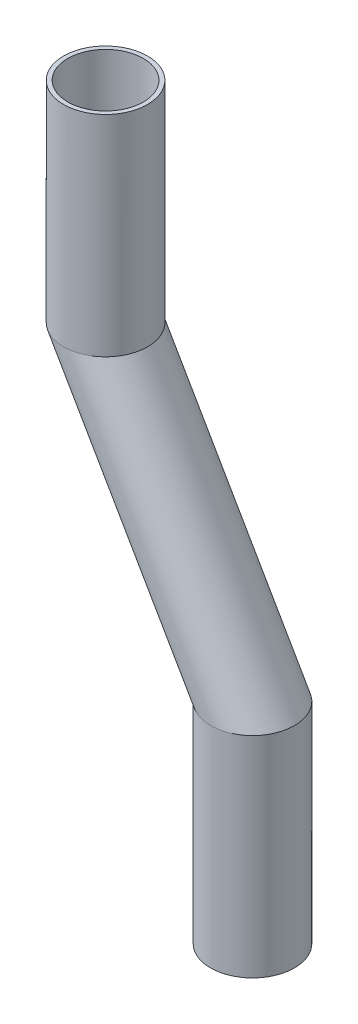
ISO-10303-21;
HEADER;
FILE_DESCRIPTION(('STEP AP214'),'2;1');
FILE_NAME('part.step','',(''),(''),'','','');
FILE_SCHEMA(('AUTOMOTIVE_DESIGN { 1 0 10303 214 1 1 1 1 }'));
ENDSEC;
DATA;
#1=APPLICATION_CONTEXT('core data for automotive mechanical design processes');
#2=APPLICATION_PROTOCOL_DEFINITION('international standard','automotive_design',2000,#1);
#3=PRODUCT_CONTEXT('',#1,'mechanical');
#4=PRODUCT('Part','Part','',(#3));
#5=PRODUCT_RELATED_PRODUCT_CATEGORY('part','',(#4));
#6=PRODUCT_DEFINITION_FORMATION('','',#4);
#7=PRODUCT_DEFINITION_CONTEXT('part definition',#1,'design');
#8=PRODUCT_DEFINITION('design','',#6,#7);
#9=PRODUCT_DEFINITION_SHAPE('','',#8);
#10=(LENGTH_UNIT() NAMED_UNIT(*) SI_UNIT(.MILLI.,.METRE.));
#11=(NAMED_UNIT(*) PLANE_ANGLE_UNIT() SI_UNIT($,.RADIAN.));
#12=(NAMED_UNIT(*) SI_UNIT($,.STERADIAN.) SOLID_ANGLE_UNIT());
#13=UNCERTAINTY_MEASURE_WITH_UNIT(LENGTH_MEASURE(1.E-05),#10,'distance_accuracy_value','');
#14=(GEOMETRIC_REPRESENTATION_CONTEXT(3) GLOBAL_UNCERTAINTY_ASSIGNED_CONTEXT((#13)) GLOBAL_UNIT_ASSIGNED_CONTEXT((#10,
#11,#12)) REPRESENTATION_CONTEXT('',''));
#15=CARTESIAN_POINT('',(0.,0.,0.));
#16=DIRECTION('',(0.,0.,1.));
#17=DIRECTION('',(1.,0.,0.));
#18=AXIS2_PLACEMENT_3D('',#15,#16,#17);
#19=CARTESIAN_POINT('',(0.,50.,0.));
#20=DIRECTION('',(0.,1.,0.));
#21=DIRECTION('',(0.,0.,1.));
#22=AXIS2_PLACEMENT_3D('',#19,#20,#21);
#23=PLANE('',#22);
#24=CARTESIAN_POINT('',(0.,50.,0.));
#25=DIRECTION('',(0.,1.,0.));
#26=DIRECTION('',(0.,0.,1.));
#27=AXIS2_PLACEMENT_3D('',#24,#25,#26);
#28=CIRCLE('',#27,10.);
#29=CARTESIAN_POINT('',(0.,50.,10.));
#30=VERTEX_POINT('',#29);
#31=EDGE_CURVE('E10',#30,#30,#28,.T.);
#32=ORIENTED_EDGE('',*,*,#31,.T.);
#33=EDGE_LOOP('',(#32));
#34=FACE_BOUND('',#33,.T.);
#35=CARTESIAN_POINT('',(0.,50.,0.));
#36=DIRECTION('',(0.,1.,0.));
#37=DIRECTION('',(0.,0.,1.));
#38=AXIS2_PLACEMENT_3D('',#35,#36,#37);
#39=CIRCLE('',#38,9.);
#40=CARTESIAN_POINT('',(0.,50.,9.));
#41=VERTEX_POINT('',#40);
#42=EDGE_CURVE('E45',#41,#41,#39,.T.);
#43=ORIENTED_EDGE('',*,*,#42,.F.);
#44=EDGE_LOOP('',(#43));
#45=FACE_BOUND('',#44,.T.);
#46=ADVANCED_FACE('F37',(#34,#45),#23,.T.);
#47=CARTESIAN_POINT('',(0.,50.,0.));
#48=DIRECTION('',(0.,-1.,0.));
#49=DIRECTION('',(0.,0.,-1.));
#50=AXIS2_PLACEMENT_3D('',#47,#48,#49);
#51=CYLINDRICAL_SURFACE('',#50,10.);
#52=ORIENTED_EDGE('',*,*,#31,.F.);
#53=EDGE_LOOP('',(#52));
#54=FACE_BOUND('',#53,.T.);
#55=CARTESIAN_POINT('',(0.,0.,0.));
#56=DIRECTION('',(0.,-1.,0.));
#57=DIRECTION('',(0.,0.,-1.));
#58=AXIS2_PLACEMENT_3D('',#55,#56,#57);
#59=CIRCLE('',#58,10.);
#60=CARTESIAN_POINT('',(0.,0.,-10.));
#61=VERTEX_POINT('',#60);
#62=EDGE_CURVE('E58',#61,#61,#59,.T.);
#63=ORIENTED_EDGE('',*,*,#62,.F.);
#64=EDGE_LOOP('',(#63));
#65=FACE_BOUND('',#64,.T.);
#66=ADVANCED_FACE('F39',(#54,#65),#51,.T.);
#67=CARTESIAN_POINT('',(0.,50.,0.));
#68=DIRECTION('',(0.,-1.,0.));
#69=DIRECTION('',(0.,0.,-1.));
#70=AXIS2_PLACEMENT_3D('',#67,#68,#69);
#71=CYLINDRICAL_SURFACE('',#70,9.);
#72=ORIENTED_EDGE('',*,*,#42,.T.);
#73=EDGE_LOOP('',(#72));
#74=FACE_BOUND('',#73,.T.);
#75=CARTESIAN_POINT('',(0.,0.,0.));
#76=DIRECTION('',(0.,1.,0.));
#77=DIRECTION('',(0.,0.,1.));
#78=AXIS2_PLACEMENT_3D('',#75,#76,#77);
#79=CIRCLE('',#78,9.);
#80=CARTESIAN_POINT('',(0.,0.,-9.));
#81=VERTEX_POINT('',#80);
#82=EDGE_CURVE('E50',#81,#81,#79,.T.);
#83=ORIENTED_EDGE('',*,*,#82,.F.);
#84=EDGE_LOOP('',(#83));
#85=FACE_BOUND('',#84,.T.);
#86=ADVANCED_FACE('F93',(#74,#85),#71,.F.);
#87=CARTESIAN_POINT('',(0.,0.,-10.));
#88=CARTESIAN_POINT('',(35.0000000000001,-60.6217782649107,-10.));
#89=CARTESIAN_POINT('',(20.,0.,-10.));
#90=CARTESIAN_POINT('',(55.0000000000001,-60.6217782649107,-10.));
#91=CARTESIAN_POINT('',(20.,0.,10.));
#92=CARTESIAN_POINT('',(55.0000000000001,-60.6217782649107,10.));
#93=CARTESIAN_POINT('',(0.,0.,10.));
#94=CARTESIAN_POINT('',(35.0000000000001,-60.6217782649107,10.));
#95=CARTESIAN_POINT('',(-20.,0.,10.));
#96=CARTESIAN_POINT('',(15.0000000000001,-60.6217782649107,10.));
#97=CARTESIAN_POINT('',(-20.,0.,-10.));
#98=CARTESIAN_POINT('',(15.0000000000001,-60.6217782649107,-10.));
#99=CARTESIAN_POINT('',(0.,0.,-10.));
#100=CARTESIAN_POINT('',(35.0000000000001,-60.6217782649107,-10.));
#101=(BOUNDED_SURFACE() B_SPLINE_SURFACE(3,1,((#87,#88),(#89,#90),(#91,#92),(#93,#94),(#95,#96),
(#97,#98),(#99,#100)),.UNSPECIFIED.,.T.,.F.,.F.) B_SPLINE_SURFACE_WITH_KNOTS((4,3,4),(2,2),(0.,
0.5,1.),(0.,1.),.UNSPECIFIED.) GEOMETRIC_REPRESENTATION_ITEM() RATIONAL_B_SPLINE_SURFACE(((1.,
1.),(0.333333333333333,0.333333333333333),(0.333333333333333,0.333333333333333),(1.,1.),
(0.333333333333333,0.333333333333333),(0.333333333333333,0.333333333333333),(1.,1.))) REPRESENTATION_ITEM('') SURFACE());
#102=CARTESIAN_POINT('',(35.0000000000001,-60.6217782649107,0.));
#103=DIRECTION('',(0.,-1.,0.));
#104=DIRECTION('',(0.,0.,-1.));
#105=AXIS2_PLACEMENT_3D('',#102,#103,#104);
#106=CIRCLE('',#105,10.);
#107=CARTESIAN_POINT('',(35.0000000000001,-60.6217782649107,-10.));
#108=VERTEX_POINT('',#107);
#109=EDGE_CURVE('E62',#108,#108,#106,.T.);
#110=CARTESIAN_POINT('',(35.0000000000001,-60.6217782649107,-10.));
#111=CARTESIAN_POINT('',(34.6354166666668,-59.9903014079845,-10.));
#112=CARTESIAN_POINT('',(34.2708333333334,-59.3588245510584,-10.));
#113=CARTESIAN_POINT('',(33.5416666666668,-58.0958708372061,-10.));
#114=CARTESIAN_POINT('',(33.1770833333334,-57.4643939802799,-10.));
#115=CARTESIAN_POINT('',(32.4479166666667,-56.2014402664276,-10.));
#116=CARTESIAN_POINT('',(32.0833333333334,-55.5699634095014,-10.));
#117=CARTESIAN_POINT('',(31.3541666666668,-54.3070096956491,-10.));
#118=CARTESIAN_POINT('',(30.9895833333334,-53.675532838723,-10.));
#119=CARTESIAN_POINT('',(30.2604166666667,-52.4125791248707,-10.));
#120=CARTESIAN_POINT('',(29.8958333333334,-51.7811022679445,-10.));
#121=CARTESIAN_POINT('',(29.1666666666667,-50.5181485540922,-10.));
#122=CARTESIAN_POINT('',(28.8020833333334,-49.8866716971661,-10.));
#123=CARTESIAN_POINT('',(28.0729166666667,-48.6237179833138,-10.));
#124=CARTESIAN_POINT('',(27.7083333333334,-47.9922411263876,-10.));
#125=CARTESIAN_POINT('',(26.9791666666667,-46.7292874125353,-10.));
#126=CARTESIAN_POINT('',(26.6145833333334,-46.0978105556092,-10.));
#127=CARTESIAN_POINT('',(25.8854166666667,-44.8348568417569,-10.));
#128=CARTESIAN_POINT('',(25.5208333333334,-44.2033799848307,-10.));
#129=CARTESIAN_POINT('',(24.7916666666667,-42.9404262709784,-10.));
#130=CARTESIAN_POINT('',(24.4270833333334,-42.3089494140522,-10.));
#131=CARTESIAN_POINT('',(23.6979166666667,-41.0459957001999,-10.));
#132=CARTESIAN_POINT('',(23.3333333333334,-40.4145188432738,-10.));
#133=CARTESIAN_POINT('',(22.6041666666667,-39.1515651294215,-10.));
#134=CARTESIAN_POINT('',(22.2395833333334,-38.5200882724953,-10.));
#135=CARTESIAN_POINT('',(21.5104166666667,-37.257134558643,-10.));
#136=CARTESIAN_POINT('',(21.1458333333334,-36.6256577017169,-10.));
#137=CARTESIAN_POINT('',(20.4166666666667,-35.3627039878646,-10.));
#138=CARTESIAN_POINT('',(20.0520833333334,-34.7312271309384,-10.));
#139=CARTESIAN_POINT('',(19.3229166666667,-33.4682734170861,-10.));
#140=CARTESIAN_POINT('',(18.9583333333334,-32.8367965601599,-10.));
#141=CARTESIAN_POINT('',(18.2291666666667,-31.5738428463076,-10.));
#142=CARTESIAN_POINT('',(17.8645833333334,-30.9423659893815,-10.));
#143=CARTESIAN_POINT('',(17.1354166666667,-29.6794122755292,-10.));
#144=CARTESIAN_POINT('',(16.7708333333334,-29.047935418603,-10.));
#145=CARTESIAN_POINT('',(16.0416666666667,-27.7849817047507,-10.));
#146=CARTESIAN_POINT('',(15.6770833333334,-27.1535048478246,-10.));
#147=CARTESIAN_POINT('',(14.9479166666667,-25.8905511339723,-10.));
#148=CARTESIAN_POINT('',(14.5833333333334,-25.2590742770461,-10.));
#149=CARTESIAN_POINT('',(13.8541666666667,-23.9961205631938,-10.));
#150=CARTESIAN_POINT('',(13.4895833333334,-23.3646437062677,-10.));
#151=CARTESIAN_POINT('',(12.7604166666667,-22.1016899924153,-10.));
#152=CARTESIAN_POINT('',(12.3958333333334,-21.4702131354892,-10.));
#153=CARTESIAN_POINT('',(11.6666666666667,-20.2072594216369,-10.));
#154=CARTESIAN_POINT('',(11.3020833333334,-19.5757825647107,-10.));
#155=CARTESIAN_POINT('',(10.5729166666667,-18.3128288508584,-10.));
#156=CARTESIAN_POINT('',(10.2083333333334,-17.6813519939323,-10.));
#157=CARTESIAN_POINT('',(9.47916666666669,-16.41839828008,-10.));
#158=CARTESIAN_POINT('',(9.11458333333336,-15.7869214231538,-10.));
#159=CARTESIAN_POINT('',(8.38541666666669,-14.5239677093015,-10.));
#160=CARTESIAN_POINT('',(8.02083333333336,-13.8924908523754,-10.));
#161=CARTESIAN_POINT('',(7.29166666666669,-12.6295371385231,-10.));
#162=CARTESIAN_POINT('',(6.92708333333335,-11.9980602815969,-10.));
#163=CARTESIAN_POINT('',(6.19791666666668,-10.7351065677446,-10.));
#164=CARTESIAN_POINT('',(5.83333333333335,-10.1036297108184,-10.));
#165=CARTESIAN_POINT('',(5.10416666666668,-8.84067599696614,-10.));
#166=CARTESIAN_POINT('',(4.73958333333335,-8.20919914003999,-10.));
#167=CARTESIAN_POINT('',(4.01041666666668,-6.94624542618768,-10.));
#168=CARTESIAN_POINT('',(3.64583333333334,-6.31476856926153,-10.));
#169=CARTESIAN_POINT('',(2.91666666666667,-5.05181485540922,-10.));
#170=CARTESIAN_POINT('',(2.55208333333334,-4.42033799848307,-10.));
#171=CARTESIAN_POINT('',(1.82291666666667,-3.15738428463076,-10.));
#172=CARTESIAN_POINT('',(1.45833333333334,-2.52590742770461,-10.));
#173=CARTESIAN_POINT('',(0.729166666666669,-1.26295371385231,-10.));
#174=CARTESIAN_POINT('',(0.364583333333334,-0.631476856926153,-10.));
#175=CARTESIAN_POINT('',(0.,0.,-10.));
#176=B_SPLINE_CURVE_WITH_KNOTS('',3,(#110,#111,#112,#113,#114,#115,#116,#117,#118,#119,#120,
#121,#122,#123,#124,#125,#126,#127,#128,#129,#130,#131,#132,#133,#134,#135,#136,#137,#138,#139,
#140,#141,#142,#143,#144,#145,#146,#147,#148,#149,#150,#151,#152,#153,#154,#155,#156,#157,#158,
#159,#160,#161,#162,#163,#164,#165,#166,#167,#168,#169,#170,#171,#172,#173,#174,#175),
.UNSPECIFIED.,.F.,.F.,(4,2,2,2,2,2,2,2,2,2,2,2,2,2,2,2,2,2,2,2,2,2,2,2,2,2,2,2,2,2,2,2,4),(0.,
2.1875,4.375,6.5625,8.75,10.9375,13.125,15.3125,17.5,19.6875,21.875,24.0625,26.25,28.4375,
30.625,32.8125,35.,37.1875,39.375,41.5625,43.75,45.9375,48.125,50.3125,52.5,54.6875,56.875,
59.0625,61.25,63.4375,65.625,67.8125,70.),.UNSPECIFIED.);
#177=EDGE_CURVE('BSEAM85',#108,#61,#176,.T.);
#178=ORIENTED_EDGE('',*,*,#109,.F.);
#179=ORIENTED_EDGE('',*,*,#62,.T.);
#180=ORIENTED_EDGE('',*,*,#177,.T.);
#181=ORIENTED_EDGE('',*,*,#177,.F.);
#182=EDGE_LOOP('',(#178,#180,#179,#181));
#183=FACE_BOUND('',#182,.T.);
#184=ADVANCED_FACE('F85',(#183),#101,.T.);
#185=CARTESIAN_POINT('',(0.,0.,-9.));
#186=CARTESIAN_POINT('',(35.0000000000001,-60.6217782649107,-9.));
#187=CARTESIAN_POINT('',(-18.,0.,-9.));
#188=CARTESIAN_POINT('',(17.0000000000001,-60.6217782649107,-9.));
#189=CARTESIAN_POINT('',(-18.,0.,9.));
#190=CARTESIAN_POINT('',(17.0000000000001,-60.6217782649107,9.));
#191=CARTESIAN_POINT('',(0.,0.,9.));
#192=CARTESIAN_POINT('',(35.0000000000001,-60.6217782649107,9.));
#193=CARTESIAN_POINT('',(18.,0.,9.));
#194=CARTESIAN_POINT('',(53.0000000000001,-60.6217782649107,9.));
#195=CARTESIAN_POINT('',(18.,0.,-9.));
#196=CARTESIAN_POINT('',(53.0000000000001,-60.6217782649107,-9.));
#197=CARTESIAN_POINT('',(0.,0.,-9.));
#198=CARTESIAN_POINT('',(35.0000000000001,-60.6217782649107,-9.));
#199=(BOUNDED_SURFACE() B_SPLINE_SURFACE(3,1,((#185,#186),(#187,#188),(#189,#190),(#191,#192),
(#193,#194),(#195,#196),(#197,#198)),.UNSPECIFIED.,.T.,.F.,.F.) B_SPLINE_SURFACE_WITH_KNOTS((4,
3,4),(2,2),(0.,0.5,1.),(0.,1.),
.UNSPECIFIED.) GEOMETRIC_REPRESENTATION_ITEM() RATIONAL_B_SPLINE_SURFACE(((1.,1.),
(0.333333333333333,0.333333333333333),(0.333333333333333,0.333333333333333),(1.,1.),
(0.333333333333333,0.333333333333333),(0.333333333333333,0.333333333333333),(1.,1.))) REPRESENTATION_ITEM('') SURFACE());
#200=CARTESIAN_POINT('',(35.0000000000001,-60.6217782649107,0.));
#201=DIRECTION('',(0.,-1.,0.));
#202=DIRECTION('',(0.,0.,-1.));
#203=AXIS2_PLACEMENT_3D('',#200,#201,#202);
#204=CIRCLE('',#203,9.);
#205=CARTESIAN_POINT('',(35.0000000000001,-60.6217782649107,-9.));
#206=VERTEX_POINT('',#205);
#207=EDGE_CURVE('E56',#206,#206,#204,.F.);
#208=CARTESIAN_POINT('',(35.0000000000001,-60.6217782649107,-9.));
#209=CARTESIAN_POINT('',(34.6354166666668,-59.9903014079845,-9.));
#210=CARTESIAN_POINT('',(34.2708333333334,-59.3588245510584,-9.));
#211=CARTESIAN_POINT('',(33.5416666666668,-58.0958708372061,-9.));
#212=CARTESIAN_POINT('',(33.1770833333334,-57.4643939802799,-9.));
#213=CARTESIAN_POINT('',(32.4479166666667,-56.2014402664276,-9.));
#214=CARTESIAN_POINT('',(32.0833333333334,-55.5699634095014,-9.));
#215=CARTESIAN_POINT('',(31.3541666666668,-54.3070096956491,-9.));
#216=CARTESIAN_POINT('',(30.9895833333334,-53.675532838723,-9.));
#217=CARTESIAN_POINT('',(30.2604166666667,-52.4125791248707,-9.));
#218=CARTESIAN_POINT('',(29.8958333333334,-51.7811022679445,-9.));
#219=CARTESIAN_POINT('',(29.1666666666667,-50.5181485540922,-9.));
#220=CARTESIAN_POINT('',(28.8020833333334,-49.8866716971661,-9.));
#221=CARTESIAN_POINT('',(28.0729166666667,-48.6237179833138,-9.));
#222=CARTESIAN_POINT('',(27.7083333333334,-47.9922411263876,-9.));
#223=CARTESIAN_POINT('',(26.9791666666667,-46.7292874125353,-9.));
#224=CARTESIAN_POINT('',(26.6145833333334,-46.0978105556092,-9.));
#225=CARTESIAN_POINT('',(25.8854166666667,-44.8348568417569,-9.));
#226=CARTESIAN_POINT('',(25.5208333333334,-44.2033799848307,-9.));
#227=CARTESIAN_POINT('',(24.7916666666667,-42.9404262709784,-9.));
#228=CARTESIAN_POINT('',(24.4270833333334,-42.3089494140522,-9.));
#229=CARTESIAN_POINT('',(23.6979166666667,-41.0459957001999,-9.));
#230=CARTESIAN_POINT('',(23.3333333333334,-40.4145188432738,-9.));
#231=CARTESIAN_POINT('',(22.6041666666667,-39.1515651294215,-9.));
#232=CARTESIAN_POINT('',(22.2395833333334,-38.5200882724953,-9.));
#233=CARTESIAN_POINT('',(21.5104166666667,-37.257134558643,-9.));
#234=CARTESIAN_POINT('',(21.1458333333334,-36.6256577017169,-9.));
#235=CARTESIAN_POINT('',(20.4166666666667,-35.3627039878646,-9.));
#236=CARTESIAN_POINT('',(20.0520833333334,-34.7312271309384,-9.));
#237=CARTESIAN_POINT('',(19.3229166666667,-33.4682734170861,-9.));
#238=CARTESIAN_POINT('',(18.9583333333334,-32.8367965601599,-9.));
#239=CARTESIAN_POINT('',(18.2291666666667,-31.5738428463076,-9.));
#240=CARTESIAN_POINT('',(17.8645833333334,-30.9423659893815,-9.));
#241=CARTESIAN_POINT('',(17.1354166666667,-29.6794122755292,-9.));
#242=CARTESIAN_POINT('',(16.7708333333334,-29.047935418603,-9.));
#243=CARTESIAN_POINT('',(16.0416666666667,-27.7849817047507,-9.));
#244=CARTESIAN_POINT('',(15.6770833333334,-27.1535048478246,-9.));
#245=CARTESIAN_POINT('',(14.9479166666667,-25.8905511339723,-9.));
#246=CARTESIAN_POINT('',(14.5833333333334,-25.2590742770461,-9.));
#247=CARTESIAN_POINT('',(13.8541666666667,-23.9961205631938,-9.));
#248=CARTESIAN_POINT('',(13.4895833333334,-23.3646437062677,-9.));
#249=CARTESIAN_POINT('',(12.7604166666667,-22.1016899924153,-9.));
#250=CARTESIAN_POINT('',(12.3958333333334,-21.4702131354892,-9.));
#251=CARTESIAN_POINT('',(11.6666666666667,-20.2072594216369,-9.));
#252=CARTESIAN_POINT('',(11.3020833333334,-19.5757825647107,-9.));
#253=CARTESIAN_POINT('',(10.5729166666667,-18.3128288508584,-9.));
#254=CARTESIAN_POINT('',(10.2083333333334,-17.6813519939323,-9.));
#255=CARTESIAN_POINT('',(9.47916666666669,-16.41839828008,-9.));
#256=CARTESIAN_POINT('',(9.11458333333336,-15.7869214231538,-9.));
#257=CARTESIAN_POINT('',(8.38541666666669,-14.5239677093015,-9.));
#258=CARTESIAN_POINT('',(8.02083333333336,-13.8924908523754,-9.));
#259=CARTESIAN_POINT('',(7.29166666666669,-12.6295371385231,-9.));
#260=CARTESIAN_POINT('',(6.92708333333335,-11.9980602815969,-9.));
#261=CARTESIAN_POINT('',(6.19791666666668,-10.7351065677446,-9.));
#262=CARTESIAN_POINT('',(5.83333333333335,-10.1036297108184,-9.));
#263=CARTESIAN_POINT('',(5.10416666666668,-8.84067599696614,-9.));
#264=CARTESIAN_POINT('',(4.73958333333335,-8.20919914003999,-9.));
#265=CARTESIAN_POINT('',(4.01041666666668,-6.94624542618768,-9.));
#266=CARTESIAN_POINT('',(3.64583333333334,-6.31476856926153,-9.));
#267=CARTESIAN_POINT('',(2.91666666666667,-5.05181485540922,-9.));
#268=CARTESIAN_POINT('',(2.55208333333334,-4.42033799848307,-9.));
#269=CARTESIAN_POINT('',(1.82291666666667,-3.15738428463076,-9.));
#270=CARTESIAN_POINT('',(1.45833333333334,-2.52590742770461,-9.));
#271=CARTESIAN_POINT('',(0.729166666666669,-1.26295371385231,-9.));
#272=CARTESIAN_POINT('',(0.364583333333334,-0.631476856926153,-9.));
#273=CARTESIAN_POINT('',(0.,0.,-9.));
#274=B_SPLINE_CURVE_WITH_KNOTS('',3,(#208,#209,#210,#211,#212,#213,#214,#215,#216,#217,#218,
#219,#220,#221,#222,#223,#224,#225,#226,#227,#228,#229,#230,#231,#232,#233,#234,#235,#236,#237,
#238,#239,#240,#241,#242,#243,#244,#245,#246,#247,#248,#249,#250,#251,#252,#253,#254,#255,#256,
#257,#258,#259,#260,#261,#262,#263,#264,#265,#266,#267,#268,#269,#270,#271,#272,#273),
.UNSPECIFIED.,.F.,.F.,(4,2,2,2,2,2,2,2,2,2,2,2,2,2,2,2,2,2,2,2,2,2,2,2,2,2,2,2,2,2,2,2,4),(0.,
2.1875,4.375,6.5625,8.75,10.9375,13.125,15.3125,17.5,19.6875,21.875,24.0625,26.25,28.4375,
30.625,32.8125,35.,37.1875,39.375,41.5625,43.75,45.9375,48.125,50.3125,52.5,54.6875,56.875,
59.0625,61.25,63.4375,65.625,67.8125,70.),.UNSPECIFIED.);
#275=EDGE_CURVE('BSEAM88',#206,#81,#274,.T.);
#276=ORIENTED_EDGE('',*,*,#207,.F.);
#277=ORIENTED_EDGE('',*,*,#82,.T.);
#278=ORIENTED_EDGE('',*,*,#275,.T.);
#279=ORIENTED_EDGE('',*,*,#275,.F.);
#280=EDGE_LOOP('',(#276,#278,#277,#279));
#281=FACE_BOUND('',#280,.T.);
#282=ADVANCED_FACE('F88',(#281),#199,.T.);
#283=CARTESIAN_POINT('',(35.0000000000001,-60.6217782649107,0.));
#284=DIRECTION('',(0.,-1.,0.));
#285=DIRECTION('',(1.,0.,0.));
#286=AXIS2_PLACEMENT_3D('',#283,#284,#285);
#287=CYLINDRICAL_SURFACE('',#286,10.);
#288=CARTESIAN_POINT('',(35.0000000000001,-110.621778264911,0.));
#289=DIRECTION('',(0.,-1.,0.));
#290=DIRECTION('',(0.,0.,-1.));
#291=AXIS2_PLACEMENT_3D('',#288,#289,#290);
#292=CIRCLE('',#291,10.);
#293=CARTESIAN_POINT('',(35.0000000000001,-110.621778264911,-10.));
#294=VERTEX_POINT('',#293);
#295=EDGE_CURVE('E70',#294,#294,#292,.T.);
#296=ORIENTED_EDGE('',*,*,#295,.F.);
#297=EDGE_LOOP('',(#296));
#298=FACE_BOUND('',#297,.T.);
#299=ORIENTED_EDGE('',*,*,#109,.T.);
#300=EDGE_LOOP('',(#299));
#301=FACE_BOUND('',#300,.T.);
#302=ADVANCED_FACE('F91',(#298,#301),#287,.T.);
#303=CARTESIAN_POINT('',(35.0000000000001,-110.621778264911,0.));
#304=DIRECTION('',(0.,-1.,0.));
#305=DIRECTION('',(0.,0.,-1.));
#306=AXIS2_PLACEMENT_3D('',#303,#304,#305);
#307=PLANE('',#306);
#308=CARTESIAN_POINT('',(35.0000000000001,-110.621778264911,0.));
#309=DIRECTION('',(0.,-1.,0.));
#310=DIRECTION('',(0.,0.,-1.));
#311=AXIS2_PLACEMENT_3D('',#308,#309,#310);
#312=CIRCLE('',#311,9.);
#313=CARTESIAN_POINT('',(35.0000000000001,-110.621778264911,-9.));
#314=VERTEX_POINT('',#313);
#315=EDGE_CURVE('E63',#314,#314,#312,.F.);
#316=ORIENTED_EDGE('',*,*,#315,.T.);
#317=EDGE_LOOP('',(#316));
#318=FACE_BOUND('',#317,.T.);
#319=ORIENTED_EDGE('',*,*,#295,.T.);
#320=EDGE_LOOP('',(#319));
#321=FACE_BOUND('',#320,.T.);
#322=ADVANCED_FACE('F78',(#318,#321),#307,.T.);
#323=CARTESIAN_POINT('',(35.0000000000001,-60.6217782649107,0.));
#324=DIRECTION('',(0.,-1.,0.));
#325=DIRECTION('',(1.,0.,0.));
#326=AXIS2_PLACEMENT_3D('',#323,#324,#325);
#327=CYLINDRICAL_SURFACE('',#326,9.);
#328=ORIENTED_EDGE('',*,*,#315,.F.);
#329=EDGE_LOOP('',(#328));
#330=FACE_BOUND('',#329,.T.);
#331=ORIENTED_EDGE('',*,*,#207,.T.);
#332=EDGE_LOOP('',(#331));
#333=FACE_BOUND('',#332,.T.);
#334=ADVANCED_FACE('F81',(#330,#333),#327,.F.);
#335=CLOSED_SHELL('',(#46,#66,#86,#184,#282,#302,#322,#334));
#336=MANIFOLD_SOLID_BREP('B2',#335);
#337=ADVANCED_BREP_SHAPE_REPRESENTATION('',(#18,#336),#14);
#338=SHAPE_DEFINITION_REPRESENTATION(#9,#337);
ENDSEC;
END-ISO-10303-21;
